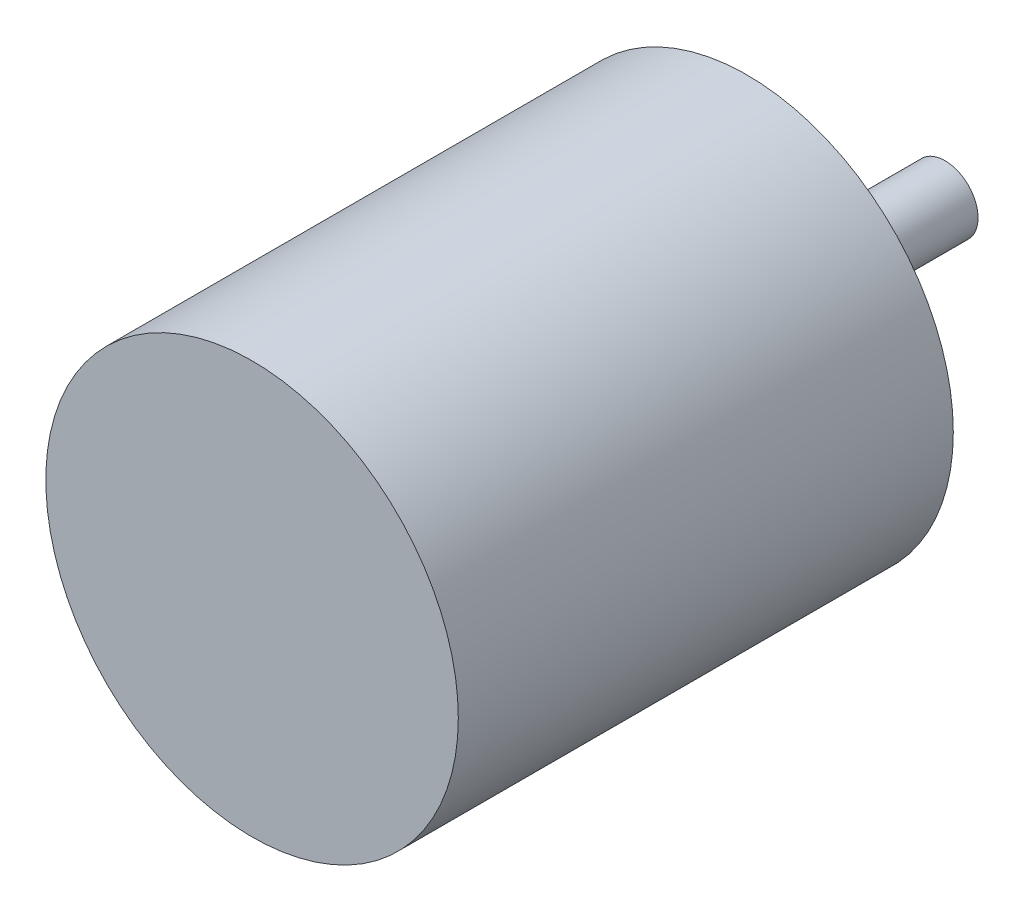
ISO-10303-21;
HEADER;
FILE_DESCRIPTION(('STEP AP214'),'2;1');
FILE_NAME('part.step','',(''),(''),'','','');
FILE_SCHEMA(('AUTOMOTIVE_DESIGN { 1 0 10303 214 1 1 1 1 }'));
ENDSEC;
DATA;
#1=APPLICATION_CONTEXT('core data for automotive mechanical design processes');
#2=APPLICATION_PROTOCOL_DEFINITION('international standard','automotive_design',2000,#1);
#3=PRODUCT_CONTEXT('',#1,'mechanical');
#4=PRODUCT('Part','Part','',(#3));
#5=PRODUCT_RELATED_PRODUCT_CATEGORY('part','',(#4));
#6=PRODUCT_DEFINITION_FORMATION('','',#4);
#7=PRODUCT_DEFINITION_CONTEXT('part definition',#1,'design');
#8=PRODUCT_DEFINITION('design','',#6,#7);
#9=PRODUCT_DEFINITION_SHAPE('','',#8);
#10=(LENGTH_UNIT() NAMED_UNIT(*) SI_UNIT(.MILLI.,.METRE.));
#11=(NAMED_UNIT(*) PLANE_ANGLE_UNIT() SI_UNIT($,.RADIAN.));
#12=(NAMED_UNIT(*) SI_UNIT($,.STERADIAN.) SOLID_ANGLE_UNIT());
#13=UNCERTAINTY_MEASURE_WITH_UNIT(LENGTH_MEASURE(1.E-05),#10,'distance_accuracy_value','');
#14=(GEOMETRIC_REPRESENTATION_CONTEXT(3) GLOBAL_UNCERTAINTY_ASSIGNED_CONTEXT((#13)) GLOBAL_UNIT_ASSIGNED_CONTEXT((#10,
#11,#12)) REPRESENTATION_CONTEXT('',''));
#15=CARTESIAN_POINT('',(0.,0.,0.));
#16=DIRECTION('',(0.,0.,1.));
#17=DIRECTION('',(1.,0.,0.));
#18=AXIS2_PLACEMENT_3D('',#15,#16,#17);
#19=CARTESIAN_POINT('',(0.,0.,-2.));
#20=DIRECTION('',(0.,0.,-1.));
#21=DIRECTION('',(-1.,0.,0.));
#22=AXIS2_PLACEMENT_3D('',#19,#20,#21);
#23=PLANE('',#22);
#24=CARTESIAN_POINT('',(0.,0.,-2.));
#25=DIRECTION('',(0.,0.,-1.));
#26=DIRECTION('',(-1.,0.,0.));
#27=AXIS2_PLACEMENT_3D('',#24,#25,#26);
#28=CIRCLE('',#27,6.);
#29=CARTESIAN_POINT('',(-6.,0.,-2.));
#30=VERTEX_POINT('',#29);
#31=EDGE_CURVE('E61',#30,#30,#28,.T.);
#32=ORIENTED_EDGE('',*,*,#31,.T.);
#33=EDGE_LOOP('',(#32));
#34=FACE_BOUND('',#33,.T.);
#35=CARTESIAN_POINT('',(0.,0.,-2.));
#36=DIRECTION('',(0.,0.,-1.));
#37=DIRECTION('',(-1.,0.,0.));
#38=AXIS2_PLACEMENT_3D('',#35,#36,#37);
#39=CIRCLE('',#38,2.);
#40=CARTESIAN_POINT('',(-2.,0.,-2.));
#41=VERTEX_POINT('',#40);
#42=EDGE_CURVE('E67',#41,#41,#39,.T.);
#43=ORIENTED_EDGE('',*,*,#42,.F.);
#44=EDGE_LOOP('',(#43));
#45=FACE_BOUND('',#44,.T.);
#46=ADVANCED_FACE('F34',(#34,#45),#23,.T.);
#47=CARTESIAN_POINT('',(0.,0.,0.));
#48=DIRECTION('',(0.,0.,1.));
#49=DIRECTION('',(1.,0.,0.));
#50=AXIS2_PLACEMENT_3D('',#47,#48,#49);
#51=PLANE('',#50);
#52=CARTESIAN_POINT('',(0.,0.,0.));
#53=DIRECTION('',(0.,0.,1.));
#54=DIRECTION('',(1.,0.,0.));
#55=AXIS2_PLACEMENT_3D('',#52,#53,#54);
#56=CIRCLE('',#55,12.5);
#57=CARTESIAN_POINT('',(12.5,0.,0.));
#58=VERTEX_POINT('',#57);
#59=EDGE_CURVE('E45',#58,#58,#56,.T.);
#60=ORIENTED_EDGE('',*,*,#59,.F.);
#61=EDGE_LOOP('',(#60));
#62=FACE_BOUND('',#61,.T.);
#63=CARTESIAN_POINT('',(-8.5,0.,0.));
#64=DIRECTION('',(0.,0.,-1.));
#65=DIRECTION('',(-1.,0.,0.));
#66=AXIS2_PLACEMENT_3D('',#63,#64,#65);
#67=CIRCLE('',#66,1.5);
#68=CARTESIAN_POINT('',(-10.,0.,0.));
#69=VERTEX_POINT('',#68);
#70=EDGE_CURVE('E52',#69,#69,#67,.T.);
#71=ORIENTED_EDGE('',*,*,#70,.F.);
#72=EDGE_LOOP('',(#71));
#73=FACE_BOUND('',#72,.T.);
#74=CARTESIAN_POINT('',(8.5,0.,0.));
#75=DIRECTION('',(0.,0.,-1.));
#76=DIRECTION('',(-1.,0.,0.));
#77=AXIS2_PLACEMENT_3D('',#74,#75,#76);
#78=CIRCLE('',#77,1.5);
#79=CARTESIAN_POINT('',(7.,0.,0.));
#80=VERTEX_POINT('',#79);
#81=EDGE_CURVE('E58',#80,#80,#78,.T.);
#82=ORIENTED_EDGE('',*,*,#81,.F.);
#83=EDGE_LOOP('',(#82));
#84=FACE_BOUND('',#83,.T.);
#85=CARTESIAN_POINT('',(0.,0.,0.));
#86=DIRECTION('',(0.,0.,1.));
#87=DIRECTION('',(1.,0.,0.));
#88=AXIS2_PLACEMENT_3D('',#85,#86,#87);
#89=CIRCLE('',#88,6.);
#90=CARTESIAN_POINT('',(6.,0.,0.));
#91=VERTEX_POINT('',#90);
#92=EDGE_CURVE('E10',#91,#91,#89,.F.);
#93=ORIENTED_EDGE('',*,*,#92,.F.);
#94=EDGE_LOOP('',(#93));
#95=FACE_BOUND('',#94,.T.);
#96=ADVANCED_FACE('F83',(#62,#73,#84,#95),#51,.F.);
#97=CARTESIAN_POINT('',(0.,0.,30.));
#98=DIRECTION('',(0.,0.,-1.));
#99=DIRECTION('',(-1.,0.,0.));
#100=AXIS2_PLACEMENT_3D('',#97,#98,#99);
#101=CYLINDRICAL_SURFACE('',#100,12.5);
#102=CARTESIAN_POINT('',(0.,0.,30.));
#103=DIRECTION('',(0.,0.,1.));
#104=DIRECTION('',(1.,0.,0.));
#105=AXIS2_PLACEMENT_3D('',#102,#103,#104);
#106=CIRCLE('',#105,12.5);
#107=CARTESIAN_POINT('',(12.5,0.,30.));
#108=VERTEX_POINT('',#107);
#109=EDGE_CURVE('E41',#108,#108,#106,.T.);
#110=ORIENTED_EDGE('',*,*,#109,.F.);
#111=EDGE_LOOP('',(#110));
#112=FACE_BOUND('',#111,.T.);
#113=ORIENTED_EDGE('',*,*,#59,.T.);
#114=EDGE_LOOP('',(#113));
#115=FACE_BOUND('',#114,.T.);
#116=ADVANCED_FACE('F36',(#112,#115),#101,.T.);
#117=CARTESIAN_POINT('',(0.,0.,30.));
#118=DIRECTION('',(0.,0.,1.));
#119=DIRECTION('',(1.,0.,0.));
#120=AXIS2_PLACEMENT_3D('',#117,#118,#119);
#121=PLANE('',#120);
#122=ORIENTED_EDGE('',*,*,#109,.T.);
#123=EDGE_LOOP('',(#122));
#124=FACE_BOUND('',#123,.T.);
#125=ADVANCED_FACE('F110',(#124),#121,.T.);
#126=CARTESIAN_POINT('',(-8.5,0.,15.));
#127=DIRECTION('',(0.,0.,-1.));
#128=DIRECTION('',(-1.,0.,0.));
#129=AXIS2_PLACEMENT_3D('',#126,#127,#128);
#130=CYLINDRICAL_SURFACE('',#129,1.5);
#131=CARTESIAN_POINT('',(-8.5,0.,15.));
#132=DIRECTION('',(0.,0.,-1.));
#133=DIRECTION('',(-1.,0.,0.));
#134=AXIS2_PLACEMENT_3D('',#131,#132,#133);
#135=CIRCLE('',#134,1.5);
#136=CARTESIAN_POINT('',(-10.,0.,15.));
#137=VERTEX_POINT('',#136);
#138=EDGE_CURVE('E50',#137,#137,#135,.T.);
#139=ORIENTED_EDGE('',*,*,#138,.F.);
#140=EDGE_LOOP('',(#139));
#141=FACE_BOUND('',#140,.T.);
#142=ORIENTED_EDGE('',*,*,#70,.T.);
#143=EDGE_LOOP('',(#142));
#144=FACE_BOUND('',#143,.T.);
#145=ADVANCED_FACE('F106',(#141,#144),#130,.F.);
#146=CARTESIAN_POINT('',(-8.5,0.,15.));
#147=DIRECTION('',(0.,0.,-1.));
#148=DIRECTION('',(-1.,0.,0.));
#149=AXIS2_PLACEMENT_3D('',#146,#147,#148);
#150=PLANE('',#149);
#151=ORIENTED_EDGE('',*,*,#138,.T.);
#152=EDGE_LOOP('',(#151));
#153=FACE_BOUND('',#152,.T.);
#154=ADVANCED_FACE('F102',(#153),#150,.T.);
#155=CARTESIAN_POINT('',(8.5,0.,15.));
#156=DIRECTION('',(0.,0.,-1.));
#157=DIRECTION('',(-1.,0.,0.));
#158=AXIS2_PLACEMENT_3D('',#155,#156,#157);
#159=CYLINDRICAL_SURFACE('',#158,1.5);
#160=CARTESIAN_POINT('',(8.5,0.,15.));
#161=DIRECTION('',(0.,0.,-1.));
#162=DIRECTION('',(-1.,0.,0.));
#163=AXIS2_PLACEMENT_3D('',#160,#161,#162);
#164=CIRCLE('',#163,1.5);
#165=CARTESIAN_POINT('',(7.,0.,15.));
#166=VERTEX_POINT('',#165);
#167=EDGE_CURVE('E55',#166,#166,#164,.T.);
#168=ORIENTED_EDGE('',*,*,#167,.F.);
#169=EDGE_LOOP('',(#168));
#170=FACE_BOUND('',#169,.T.);
#171=ORIENTED_EDGE('',*,*,#81,.T.);
#172=EDGE_LOOP('',(#171));
#173=FACE_BOUND('',#172,.T.);
#174=ADVANCED_FACE('F98',(#170,#173),#159,.F.);
#175=CARTESIAN_POINT('',(8.5,0.,15.));
#176=DIRECTION('',(0.,0.,-1.));
#177=DIRECTION('',(-1.,0.,0.));
#178=AXIS2_PLACEMENT_3D('',#175,#176,#177);
#179=PLANE('',#178);
#180=ORIENTED_EDGE('',*,*,#167,.T.);
#181=EDGE_LOOP('',(#180));
#182=FACE_BOUND('',#181,.T.);
#183=ADVANCED_FACE('F94',(#182),#179,.T.);
#184=CARTESIAN_POINT('',(0.,0.,-2.));
#185=DIRECTION('',(0.,0.,1.));
#186=DIRECTION('',(1.,0.,0.));
#187=AXIS2_PLACEMENT_3D('',#184,#185,#186);
#188=CYLINDRICAL_SURFACE('',#187,6.);
#189=ORIENTED_EDGE('',*,*,#31,.F.);
#190=EDGE_LOOP('',(#189));
#191=FACE_BOUND('',#190,.T.);
#192=ORIENTED_EDGE('',*,*,#92,.T.);
#193=EDGE_LOOP('',(#192));
#194=FACE_BOUND('',#193,.T.);
#195=ADVANCED_FACE('F78',(#191,#194),#188,.T.);
#196=CARTESIAN_POINT('',(0.,0.,-12.));
#197=DIRECTION('',(0.,0.,1.));
#198=DIRECTION('',(1.,0.,0.));
#199=AXIS2_PLACEMENT_3D('',#196,#197,#198);
#200=CYLINDRICAL_SURFACE('',#199,2.);
#201=CARTESIAN_POINT('',(0.,0.,-12.));
#202=DIRECTION('',(0.,0.,-1.));
#203=DIRECTION('',(-1.,0.,0.));
#204=AXIS2_PLACEMENT_3D('',#201,#202,#203);
#205=CIRCLE('',#204,2.);
#206=CARTESIAN_POINT('',(-2.,0.,-12.));
#207=VERTEX_POINT('',#206);
#208=EDGE_CURVE('E66',#207,#207,#205,.T.);
#209=ORIENTED_EDGE('',*,*,#208,.F.);
#210=EDGE_LOOP('',(#209));
#211=FACE_BOUND('',#210,.T.);
#212=ORIENTED_EDGE('',*,*,#42,.T.);
#213=EDGE_LOOP('',(#212));
#214=FACE_BOUND('',#213,.T.);
#215=ADVANCED_FACE('F75',(#211,#214),#200,.T.);
#216=CARTESIAN_POINT('',(0.,0.,-12.));
#217=DIRECTION('',(0.,0.,-1.));
#218=DIRECTION('',(-1.,0.,0.));
#219=AXIS2_PLACEMENT_3D('',#216,#217,#218);
#220=PLANE('',#219);
#221=ORIENTED_EDGE('',*,*,#208,.T.);
#222=EDGE_LOOP('',(#221));
#223=FACE_BOUND('',#222,.T.);
#224=ADVANCED_FACE('F73',(#223),#220,.T.);
#225=CLOSED_SHELL('',(#46,#96,#116,#125,#145,#154,#174,#183,#195,#215,#224));
#226=MANIFOLD_SOLID_BREP('B2',#225);
#227=ADVANCED_BREP_SHAPE_REPRESENTATION('',(#18,#226),#14);
#228=SHAPE_DEFINITION_REPRESENTATION(#9,#227);
ENDSEC;
END-ISO-10303-21;
